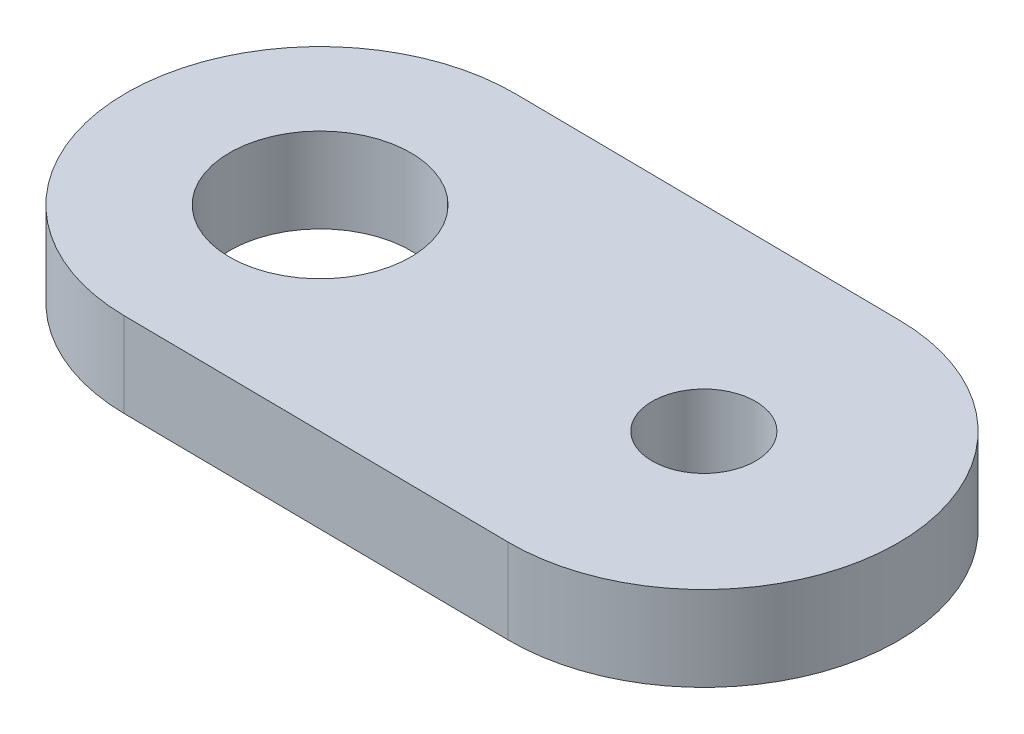
ISO-10303-21;
HEADER;
FILE_DESCRIPTION(('STEP AP214'),'2;1');
FILE_NAME('part.step','',(''),(''),'','','');
FILE_SCHEMA(('AUTOMOTIVE_DESIGN { 1 0 10303 214 1 1 1 1 }'));
ENDSEC;
DATA;
#1=APPLICATION_CONTEXT('core data for automotive mechanical design processes');
#2=APPLICATION_PROTOCOL_DEFINITION('international standard','automotive_design',2000,#1);
#3=PRODUCT_CONTEXT('',#1,'mechanical');
#4=PRODUCT('Part','Part','',(#3));
#5=PRODUCT_RELATED_PRODUCT_CATEGORY('part','',(#4));
#6=PRODUCT_DEFINITION_FORMATION('','',#4);
#7=PRODUCT_DEFINITION_CONTEXT('part definition',#1,'design');
#8=PRODUCT_DEFINITION('design','',#6,#7);
#9=PRODUCT_DEFINITION_SHAPE('','',#8);
#10=(LENGTH_UNIT() NAMED_UNIT(*) SI_UNIT(.MILLI.,.METRE.));
#11=(NAMED_UNIT(*) PLANE_ANGLE_UNIT() SI_UNIT($,.RADIAN.));
#12=(NAMED_UNIT(*) SI_UNIT($,.STERADIAN.) SOLID_ANGLE_UNIT());
#13=UNCERTAINTY_MEASURE_WITH_UNIT(LENGTH_MEASURE(1.E-05),#10,'distance_accuracy_value','');
#14=(GEOMETRIC_REPRESENTATION_CONTEXT(3) GLOBAL_UNCERTAINTY_ASSIGNED_CONTEXT((#13)) GLOBAL_UNIT_ASSIGNED_CONTEXT((#10,
#11,#12)) REPRESENTATION_CONTEXT('',''));
#15=CARTESIAN_POINT('',(0.,0.,0.));
#16=DIRECTION('',(0.,0.,1.));
#17=DIRECTION('',(1.,0.,0.));
#18=AXIS2_PLACEMENT_3D('',#15,#16,#17);
#19=CARTESIAN_POINT('',(-105.,-79.2217883919803,60.));
#20=DIRECTION('',(0.,1.,0.));
#21=DIRECTION('',(0.,0.,1.));
#22=AXIS2_PLACEMENT_3D('',#19,#20,#21);
#23=PLANE('',#22);
#24=CARTESIAN_POINT('',(-105.,-79.2217883919803,60.));
#25=DIRECTION('',(0.,1.,0.));
#26=DIRECTION('',(0.,0.,1.));
#27=AXIS2_PLACEMENT_3D('',#24,#25,#26);
#28=CIRCLE('',#27,3.50000000000001);
#29=CARTESIAN_POINT('',(-105.,-79.2217883919803,63.5));
#30=VERTEX_POINT('',#29);
#31=EDGE_CURVE('E100',#30,#30,#28,.T.);
#32=ORIENTED_EDGE('',*,*,#31,.F.);
#33=EDGE_LOOP('',(#32));
#34=FACE_BOUND('',#33,.T.);
#35=CARTESIAN_POINT('',(-105.,-79.2217883919803,60.));
#36=DIRECTION('',(0.,1.,0.));
#37=DIRECTION('',(0.,0.,1.));
#38=AXIS2_PLACEMENT_3D('',#35,#36,#37);
#39=CIRCLE('',#38,7.5);
#40=CARTESIAN_POINT('',(-104.9203690306,-79.2217883919803,52.5004227513338));
#41=VERTEX_POINT('',#40);
#42=CARTESIAN_POINT('',(-105.0796309694,-79.2217883919803,67.4995772486662));
#43=VERTEX_POINT('',#42);
#44=EDGE_CURVE('E85',#41,#43,#39,.T.);
#45=ORIENTED_EDGE('',*,*,#44,.T.);
#46=DIRECTION('',(0.999943633155499,0.,0.0106174625867099));
#47=VECTOR('',#46,1.);
#48=CARTESIAN_POINT('',(-105.0796309694,-79.2217883919803,67.4995772486662));
#49=LINE('',#48,#47);
#50=CARTESIAN_POINT('',(-90.0796309694003,-79.2217883919803,67.6588481650659));
#51=VERTEX_POINT('',#50);
#52=EDGE_CURVE('E80',#43,#51,#49,.T.);
#53=ORIENTED_EDGE('',*,*,#52,.T.);
#54=CARTESIAN_POINT('',(-90.,-79.2217883919803,60.1592709163996));
#55=DIRECTION('',(0.,1.,0.));
#56=DIRECTION('',(0.,0.,1.));
#57=AXIS2_PLACEMENT_3D('',#54,#55,#56);
#58=CIRCLE('',#57,7.5);
#59=CARTESIAN_POINT('',(-89.9203690305997,-79.2217883919803,52.6596936677334));
#60=VERTEX_POINT('',#59);
#61=EDGE_CURVE('E83',#51,#60,#58,.T.);
#62=ORIENTED_EDGE('',*,*,#61,.T.);
#63=DIRECTION('',(-0.999943633155499,0.,-0.0106174625867099));
#64=VECTOR('',#63,1.);
#65=CARTESIAN_POINT('',(-104.9203690306,-79.2217883919803,52.5004227513338));
#66=LINE('',#65,#64);
#67=EDGE_CURVE('E50',#60,#41,#66,.T.);
#68=ORIENTED_EDGE('',*,*,#67,.T.);
#69=EDGE_LOOP('',(#45,#53,#62,#68));
#70=FACE_BOUND('',#69,.T.);
#71=CARTESIAN_POINT('',(-90.,-79.2217883919803,60.1592709163996));
#72=DIRECTION('',(0.,1.,0.));
#73=DIRECTION('',(0.,0.,1.));
#74=AXIS2_PLACEMENT_3D('',#71,#72,#73);
#75=CIRCLE('',#74,2.);
#76=CARTESIAN_POINT('',(-90.,-79.2217883919803,62.1592709163996));
#77=VERTEX_POINT('',#76);
#78=EDGE_CURVE('E115',#77,#77,#75,.T.);
#79=ORIENTED_EDGE('',*,*,#78,.F.);
#80=EDGE_LOOP('',(#79));
#81=FACE_BOUND('',#80,.T.);
#82=ADVANCED_FACE('F33',(#34,#70,#81),#23,.T.);
#83=CARTESIAN_POINT('',(-105.,-82.5,60.));
#84=DIRECTION('',(0.,1.,0.));
#85=DIRECTION('',(0.,0.,1.));
#86=AXIS2_PLACEMENT_3D('',#83,#84,#85);
#87=PLANE('',#86);
#88=CARTESIAN_POINT('',(-105.,-82.5,60.));
#89=DIRECTION('',(0.,1.,0.));
#90=DIRECTION('',(0.,0.,1.));
#91=AXIS2_PLACEMENT_3D('',#88,#89,#90);
#92=CIRCLE('',#91,7.5);
#93=CARTESIAN_POINT('',(-104.9203690306,-82.5,52.5004227513338));
#94=VERTEX_POINT('',#93);
#95=CARTESIAN_POINT('',(-105.0796309694,-82.5,67.4995772486662));
#96=VERTEX_POINT('',#95);
#97=EDGE_CURVE('E97',#94,#96,#92,.T.);
#98=ORIENTED_EDGE('',*,*,#97,.F.);
#99=DIRECTION('',(-0.999943633155499,0.,-0.0106174625867099));
#100=VECTOR('',#99,1.);
#101=CARTESIAN_POINT('',(-104.9203690306,-82.5,52.5004227513338));
#102=LINE('',#101,#100);
#103=CARTESIAN_POINT('',(-89.9203690305997,-82.5,52.6596936677334));
#104=VERTEX_POINT('',#103);
#105=EDGE_CURVE('E73',#104,#94,#102,.T.);
#106=ORIENTED_EDGE('',*,*,#105,.F.);
#107=CARTESIAN_POINT('',(-90.,-82.5,60.1592709163996));
#108=DIRECTION('',(0.,1.,0.));
#109=DIRECTION('',(0.,0.,1.));
#110=AXIS2_PLACEMENT_3D('',#107,#108,#109);
#111=CIRCLE('',#110,7.5);
#112=CARTESIAN_POINT('',(-90.0796309694003,-82.5,67.6588481650659));
#113=VERTEX_POINT('',#112);
#114=EDGE_CURVE('E67',#113,#104,#111,.T.);
#115=ORIENTED_EDGE('',*,*,#114,.F.);
#116=DIRECTION('',(0.999943633155499,0.,0.0106174625867099));
#117=VECTOR('',#116,1.);
#118=CARTESIAN_POINT('',(-105.0796309694,-82.5,67.4995772486662));
#119=LINE('',#118,#117);
#120=EDGE_CURVE('E89',#96,#113,#119,.T.);
#121=ORIENTED_EDGE('',*,*,#120,.F.);
#122=EDGE_LOOP('',(#98,#106,#115,#121));
#123=FACE_BOUND('',#122,.T.);
#124=CARTESIAN_POINT('',(-105.,-82.5,60.));
#125=DIRECTION('',(0.,1.,0.));
#126=DIRECTION('',(0.,0.,1.));
#127=AXIS2_PLACEMENT_3D('',#124,#125,#126);
#128=CIRCLE('',#127,3.50000000000001);
#129=CARTESIAN_POINT('',(-105.,-82.5,63.5));
#130=VERTEX_POINT('',#129);
#131=EDGE_CURVE('E112',#130,#130,#128,.T.);
#132=ORIENTED_EDGE('',*,*,#131,.T.);
#133=EDGE_LOOP('',(#132));
#134=FACE_BOUND('',#133,.T.);
#135=CARTESIAN_POINT('',(-90.,-82.5,60.1592709163996));
#136=DIRECTION('',(0.,1.,0.));
#137=DIRECTION('',(0.,0.,1.));
#138=AXIS2_PLACEMENT_3D('',#135,#136,#137);
#139=CIRCLE('',#138,2.);
#140=CARTESIAN_POINT('',(-90.,-82.5,62.1592709163996));
#141=VERTEX_POINT('',#140);
#142=EDGE_CURVE('E118',#141,#141,#139,.T.);
#143=ORIENTED_EDGE('',*,*,#142,.T.);
#144=EDGE_LOOP('',(#143));
#145=FACE_BOUND('',#144,.T.);
#146=ADVANCED_FACE('F108',(#123,#134,#145),#87,.F.);
#147=CARTESIAN_POINT('',(-105.,-79.2217883919803,60.));
#148=DIRECTION('',(0.,-1.,0.));
#149=DIRECTION('',(0.,0.,-1.));
#150=AXIS2_PLACEMENT_3D('',#147,#148,#149);
#151=CYLINDRICAL_SURFACE('',#150,7.5);
#152=ORIENTED_EDGE('',*,*,#97,.T.);
#153=DIRECTION('',(0.,-1.,0.));
#154=VECTOR('',#153,1.);
#155=CARTESIAN_POINT('',(-105.0796309694,-79.2217883919803,67.4995772486662));
#156=LINE('',#155,#154);
#157=EDGE_CURVE('E11',#43,#96,#156,.T.);
#158=ORIENTED_EDGE('',*,*,#157,.F.);
#159=ORIENTED_EDGE('',*,*,#44,.F.);
#160=DIRECTION('',(0.,-1.,0.));
#161=VECTOR('',#160,1.);
#162=CARTESIAN_POINT('',(-104.9203690306,-79.2217883919803,52.5004227513338));
#163=LINE('',#162,#161);
#164=EDGE_CURVE('E93',#41,#94,#163,.T.);
#165=ORIENTED_EDGE('',*,*,#164,.T.);
#166=EDGE_LOOP('',(#152,#158,#159,#165));
#167=FACE_BOUND('',#166,.T.);
#168=ADVANCED_FACE('F35',(#167),#151,.T.);
#169=CARTESIAN_POINT('',(-105.0796309694,-79.2217883919803,67.4995772486662));
#170=DIRECTION('',(0.0106174625867099,0.,-0.999943633155499));
#171=DIRECTION('',(-0.999943633155499,0.,-0.0106174625867099));
#172=AXIS2_PLACEMENT_3D('',#169,#170,#171);
#173=PLANE('',#172);
#174=ORIENTED_EDGE('',*,*,#120,.T.);
#175=DIRECTION('',(0.,-1.,0.));
#176=VECTOR('',#175,1.);
#177=CARTESIAN_POINT('',(-90.0796309694003,-79.2217883919803,67.6588481650659));
#178=LINE('',#177,#176);
#179=EDGE_CURVE('E42',#51,#113,#178,.T.);
#180=ORIENTED_EDGE('',*,*,#179,.F.);
#181=ORIENTED_EDGE('',*,*,#52,.F.);
#182=ORIENTED_EDGE('',*,*,#157,.T.);
#183=EDGE_LOOP('',(#174,#180,#181,#182));
#184=FACE_BOUND('',#183,.T.);
#185=ADVANCED_FACE('F88',(#184),#173,.F.);
#186=CARTESIAN_POINT('',(-90.,-79.2217883919803,60.1592709163996));
#187=DIRECTION('',(0.,-1.,0.));
#188=DIRECTION('',(0.,0.,-1.));
#189=AXIS2_PLACEMENT_3D('',#186,#187,#188);
#190=CYLINDRICAL_SURFACE('',#189,7.5);
#191=ORIENTED_EDGE('',*,*,#114,.T.);
#192=DIRECTION('',(0.,-1.,0.));
#193=VECTOR('',#192,1.);
#194=CARTESIAN_POINT('',(-89.9203690305997,-79.2217883919803,52.6596936677334));
#195=LINE('',#194,#193);
#196=EDGE_CURVE('E90',#60,#104,#195,.T.);
#197=ORIENTED_EDGE('',*,*,#196,.F.);
#198=ORIENTED_EDGE('',*,*,#61,.F.);
#199=ORIENTED_EDGE('',*,*,#179,.T.);
#200=EDGE_LOOP('',(#191,#197,#198,#199));
#201=FACE_BOUND('',#200,.T.);
#202=ADVANCED_FACE('F91',(#201),#190,.T.);
#203=CARTESIAN_POINT('',(-104.9203690306,-79.2217883919803,52.5004227513338));
#204=DIRECTION('',(-0.0106174625867099,0.,0.999943633155499));
#205=DIRECTION('',(0.999943633155499,0.,0.0106174625867099));
#206=AXIS2_PLACEMENT_3D('',#203,#204,#205);
#207=PLANE('',#206);
#208=ORIENTED_EDGE('',*,*,#105,.T.);
#209=ORIENTED_EDGE('',*,*,#164,.F.);
#210=ORIENTED_EDGE('',*,*,#67,.F.);
#211=ORIENTED_EDGE('',*,*,#196,.T.);
#212=EDGE_LOOP('',(#208,#209,#210,#211));
#213=FACE_BOUND('',#212,.T.);
#214=ADVANCED_FACE('F105',(#213),#207,.F.);
#215=CARTESIAN_POINT('',(-105.,-79.2217883919803,60.));
#216=DIRECTION('',(0.,-1.,0.));
#217=DIRECTION('',(0.,0.,-1.));
#218=AXIS2_PLACEMENT_3D('',#215,#216,#217);
#219=CYLINDRICAL_SURFACE('',#218,3.50000000000001);
#220=ORIENTED_EDGE('',*,*,#31,.T.);
#221=EDGE_LOOP('',(#220));
#222=FACE_BOUND('',#221,.T.);
#223=ORIENTED_EDGE('',*,*,#131,.F.);
#224=EDGE_LOOP('',(#223));
#225=FACE_BOUND('',#224,.T.);
#226=ADVANCED_FACE('F135',(#222,#225),#219,.F.);
#227=CARTESIAN_POINT('',(-90.,-79.2217883919803,60.1592709163996));
#228=DIRECTION('',(0.,-1.,0.));
#229=DIRECTION('',(0.,0.,-1.));
#230=AXIS2_PLACEMENT_3D('',#227,#228,#229);
#231=CYLINDRICAL_SURFACE('',#230,2.);
#232=ORIENTED_EDGE('',*,*,#78,.T.);
#233=EDGE_LOOP('',(#232));
#234=FACE_BOUND('',#233,.T.);
#235=ORIENTED_EDGE('',*,*,#142,.F.);
#236=EDGE_LOOP('',(#235));
#237=FACE_BOUND('',#236,.T.);
#238=ADVANCED_FACE('F124',(#234,#237),#231,.F.);
#239=CLOSED_SHELL('',(#82,#146,#168,#185,#202,#214,#226,#238));
#240=MANIFOLD_SOLID_BREP('B2',#239);
#241=ADVANCED_BREP_SHAPE_REPRESENTATION('',(#18,#240),#14);
#242=SHAPE_DEFINITION_REPRESENTATION(#9,#241);
ENDSEC;
END-ISO-10303-21;
